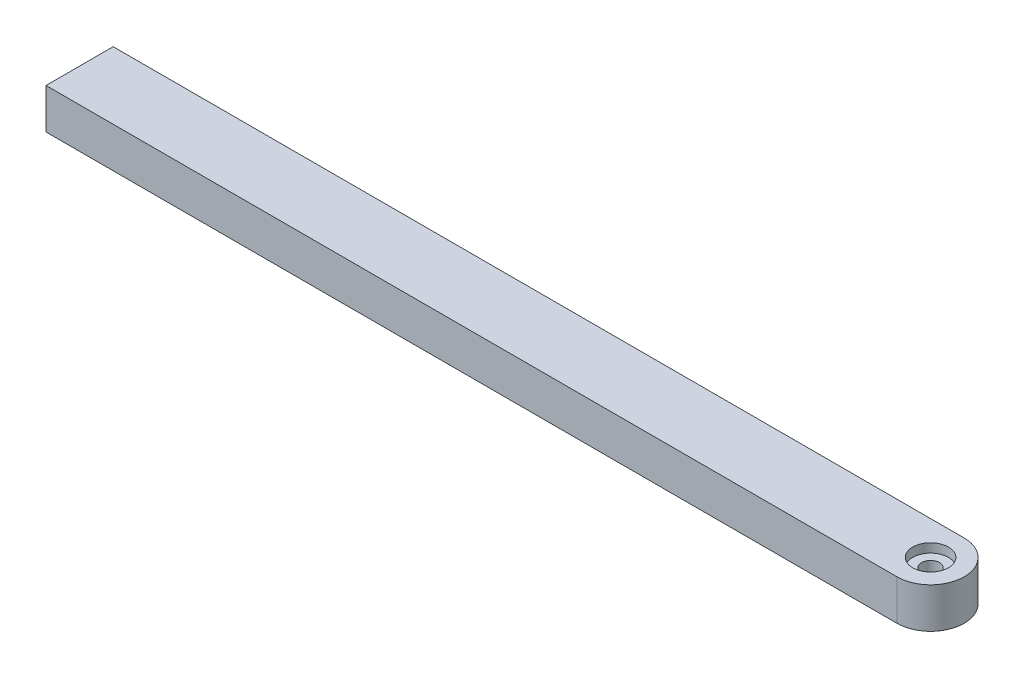
ISO-10303-21;
HEADER;
FILE_DESCRIPTION(('STEP AP214'),'2;1');
FILE_NAME('part.step','',(''),(''),'','','');
FILE_SCHEMA(('AUTOMOTIVE_DESIGN { 1 0 10303 214 1 1 1 1 }'));
ENDSEC;
DATA;
#1=APPLICATION_CONTEXT('core data for automotive mechanical design processes');
#2=APPLICATION_PROTOCOL_DEFINITION('international standard','automotive_design',2000,#1);
#3=PRODUCT_CONTEXT('',#1,'mechanical');
#4=PRODUCT('Part','Part','',(#3));
#5=PRODUCT_RELATED_PRODUCT_CATEGORY('part','',(#4));
#6=PRODUCT_DEFINITION_FORMATION('','',#4);
#7=PRODUCT_DEFINITION_CONTEXT('part definition',#1,'design');
#8=PRODUCT_DEFINITION('design','',#6,#7);
#9=PRODUCT_DEFINITION_SHAPE('','',#8);
#10=(LENGTH_UNIT() NAMED_UNIT(*) SI_UNIT(.MILLI.,.METRE.));
#11=(NAMED_UNIT(*) PLANE_ANGLE_UNIT() SI_UNIT($,.RADIAN.));
#12=(NAMED_UNIT(*) SI_UNIT($,.STERADIAN.) SOLID_ANGLE_UNIT());
#13=UNCERTAINTY_MEASURE_WITH_UNIT(LENGTH_MEASURE(1.E-05),#10,'distance_accuracy_value','');
#14=(GEOMETRIC_REPRESENTATION_CONTEXT(3) GLOBAL_UNCERTAINTY_ASSIGNED_CONTEXT((#13)) GLOBAL_UNIT_ASSIGNED_CONTEXT((#10,
#11,#12)) REPRESENTATION_CONTEXT('',''));
#15=CARTESIAN_POINT('',(0.,0.,0.));
#16=DIRECTION('',(0.,0.,1.));
#17=DIRECTION('',(1.,0.,0.));
#18=AXIS2_PLACEMENT_3D('',#15,#16,#17);
#19=CARTESIAN_POINT('',(180.,18.,0.));
#20=DIRECTION('',(0.,-1.,0.));
#21=DIRECTION('',(0.,0.,-1.));
#22=AXIS2_PLACEMENT_3D('',#19,#20,#21);
#23=CYLINDRICAL_SURFACE('',#22,3.99999999999999);
#24=CARTESIAN_POINT('',(180.,0.,0.));
#25=DIRECTION('',(0.,1.,0.));
#26=DIRECTION('',(0.,0.,1.));
#27=AXIS2_PLACEMENT_3D('',#24,#25,#26);
#28=CIRCLE('',#27,3.99999999999999);
#29=CARTESIAN_POINT('',(180.,0.,3.99999999999999));
#30=VERTEX_POINT('',#29);
#31=EDGE_CURVE('E107',#30,#30,#28,.T.);
#32=ORIENTED_EDGE('',*,*,#31,.F.);
#33=EDGE_LOOP('',(#32));
#34=FACE_BOUND('',#33,.T.);
#35=CARTESIAN_POINT('',(180.,14.,0.));
#36=DIRECTION('',(0.,1.,0.));
#37=DIRECTION('',(0.,0.,1.));
#38=AXIS2_PLACEMENT_3D('',#35,#36,#37);
#39=CIRCLE('',#38,3.99999999999999);
#40=CARTESIAN_POINT('',(180.,14.,3.99999999999999));
#41=VERTEX_POINT('',#40);
#42=EDGE_CURVE('E42',#41,#41,#39,.T.);
#43=ORIENTED_EDGE('',*,*,#42,.T.);
#44=EDGE_LOOP('',(#43));
#45=FACE_BOUND('',#44,.T.);
#46=ADVANCED_FACE('F38',(#34,#45),#23,.F.);
#47=CARTESIAN_POINT('',(180.,18.,0.));
#48=DIRECTION('',(0.,-1.,0.));
#49=DIRECTION('',(0.,0.,-1.));
#50=AXIS2_PLACEMENT_3D('',#47,#48,#49);
#51=PLANE('',#50);
#52=CARTESIAN_POINT('',(180.,18.,0.));
#53=DIRECTION('',(0.,1.,0.));
#54=DIRECTION('',(0.,0.,1.));
#55=AXIS2_PLACEMENT_3D('',#52,#53,#54);
#56=CIRCLE('',#55,8.00000000000001);
#57=CARTESIAN_POINT('',(180.,18.,8.00000000000001));
#58=VERTEX_POINT('',#57);
#59=EDGE_CURVE('E123',#58,#58,#56,.T.);
#60=ORIENTED_EDGE('',*,*,#59,.F.);
#61=EDGE_LOOP('',(#60));
#62=FACE_BOUND('',#61,.T.);
#63=DIRECTION('',(-1.,0.,0.));
#64=VECTOR('',#63,1.);
#65=CARTESIAN_POINT('',(-200.,18.,-15.));
#66=LINE('',#65,#64);
#67=CARTESIAN_POINT('',(180.,18.,-15.));
#68=VERTEX_POINT('',#67);
#69=CARTESIAN_POINT('',(-200.,18.,-15.));
#70=VERTEX_POINT('',#69);
#71=EDGE_CURVE('E91',#68,#70,#66,.T.);
#72=ORIENTED_EDGE('',*,*,#71,.T.);
#73=DIRECTION('',(0.,0.,1.));
#74=VECTOR('',#73,1.);
#75=CARTESIAN_POINT('',(-200.,18.,-15.));
#76=LINE('',#75,#74);
#77=CARTESIAN_POINT('',(-200.,18.,15.));
#78=VERTEX_POINT('',#77);
#79=EDGE_CURVE('E86',#70,#78,#76,.T.);
#80=ORIENTED_EDGE('',*,*,#79,.T.);
#81=DIRECTION('',(1.,0.,0.));
#82=VECTOR('',#81,1.);
#83=CARTESIAN_POINT('',(-200.,18.,15.));
#84=LINE('',#83,#82);
#85=CARTESIAN_POINT('',(180.,18.,15.));
#86=VERTEX_POINT('',#85);
#87=EDGE_CURVE('E89',#78,#86,#84,.T.);
#88=ORIENTED_EDGE('',*,*,#87,.T.);
#89=CARTESIAN_POINT('',(180.,18.,0.));
#90=DIRECTION('',(0.,1.,0.));
#91=DIRECTION('',(0.,0.,-1.));
#92=AXIS2_PLACEMENT_3D('',#89,#90,#91);
#93=CIRCLE('',#92,15.);
#94=EDGE_CURVE('E56',#86,#68,#93,.T.);
#95=ORIENTED_EDGE('',*,*,#94,.T.);
#96=EDGE_LOOP('',(#72,#80,#88,#95));
#97=FACE_BOUND('',#96,.T.);
#98=ADVANCED_FACE('F87',(#62,#97),#51,.F.);
#99=CARTESIAN_POINT('',(180.,0.,0.));
#100=DIRECTION('',(0.,-1.,0.));
#101=DIRECTION('',(0.,0.,-1.));
#102=AXIS2_PLACEMENT_3D('',#99,#100,#101);
#103=PLANE('',#102);
#104=DIRECTION('',(-1.,0.,0.));
#105=VECTOR('',#104,1.);
#106=CARTESIAN_POINT('',(-200.,0.,-15.));
#107=LINE('',#106,#105);
#108=CARTESIAN_POINT('',(180.,0.,-15.));
#109=VERTEX_POINT('',#108);
#110=CARTESIAN_POINT('',(-200.,0.,-15.));
#111=VERTEX_POINT('',#110);
#112=EDGE_CURVE('E104',#109,#111,#107,.T.);
#113=ORIENTED_EDGE('',*,*,#112,.F.);
#114=CARTESIAN_POINT('',(180.,0.,0.));
#115=DIRECTION('',(0.,1.,0.));
#116=DIRECTION('',(0.,0.,-1.));
#117=AXIS2_PLACEMENT_3D('',#114,#115,#116);
#118=CIRCLE('',#117,15.);
#119=CARTESIAN_POINT('',(180.,0.,15.));
#120=VERTEX_POINT('',#119);
#121=EDGE_CURVE('E79',#120,#109,#118,.T.);
#122=ORIENTED_EDGE('',*,*,#121,.F.);
#123=DIRECTION('',(1.,0.,0.));
#124=VECTOR('',#123,1.);
#125=CARTESIAN_POINT('',(-200.,0.,15.));
#126=LINE('',#125,#124);
#127=CARTESIAN_POINT('',(-200.,0.,15.));
#128=VERTEX_POINT('',#127);
#129=EDGE_CURVE('E73',#128,#120,#126,.T.);
#130=ORIENTED_EDGE('',*,*,#129,.F.);
#131=DIRECTION('',(0.,0.,1.));
#132=VECTOR('',#131,1.);
#133=CARTESIAN_POINT('',(-200.,0.,-15.));
#134=LINE('',#133,#132);
#135=EDGE_CURVE('E95',#111,#128,#134,.T.);
#136=ORIENTED_EDGE('',*,*,#135,.F.);
#137=EDGE_LOOP('',(#113,#122,#130,#136));
#138=FACE_BOUND('',#137,.T.);
#139=ORIENTED_EDGE('',*,*,#31,.T.);
#140=EDGE_LOOP('',(#139));
#141=FACE_BOUND('',#140,.T.);
#142=ADVANCED_FACE('F116',(#138,#141),#103,.T.);
#143=CARTESIAN_POINT('',(-200.,18.,-15.));
#144=DIRECTION('',(0.,0.,1.));
#145=DIRECTION('',(1.,0.,0.));
#146=AXIS2_PLACEMENT_3D('',#143,#144,#145);
#147=PLANE('',#146);
#148=ORIENTED_EDGE('',*,*,#112,.T.);
#149=DIRECTION('',(0.,-1.,0.));
#150=VECTOR('',#149,1.);
#151=CARTESIAN_POINT('',(-200.,18.,-15.));
#152=LINE('',#151,#150);
#153=EDGE_CURVE('E11',#70,#111,#152,.T.);
#154=ORIENTED_EDGE('',*,*,#153,.F.);
#155=ORIENTED_EDGE('',*,*,#71,.F.);
#156=DIRECTION('',(0.,-1.,0.));
#157=VECTOR('',#156,1.);
#158=CARTESIAN_POINT('',(180.,18.,-15.));
#159=LINE('',#158,#157);
#160=EDGE_CURVE('E100',#68,#109,#159,.T.);
#161=ORIENTED_EDGE('',*,*,#160,.T.);
#162=EDGE_LOOP('',(#148,#154,#155,#161));
#163=FACE_BOUND('',#162,.T.);
#164=ADVANCED_FACE('F40',(#163),#147,.F.);
#165=CARTESIAN_POINT('',(-200.,18.,-15.));
#166=DIRECTION('',(1.,0.,0.));
#167=DIRECTION('',(0.,0.,-1.));
#168=AXIS2_PLACEMENT_3D('',#165,#166,#167);
#169=PLANE('',#168);
#170=ORIENTED_EDGE('',*,*,#135,.T.);
#171=DIRECTION('',(0.,-1.,0.));
#172=VECTOR('',#171,1.);
#173=CARTESIAN_POINT('',(-200.,18.,15.));
#174=LINE('',#173,#172);
#175=EDGE_CURVE('E48',#78,#128,#174,.T.);
#176=ORIENTED_EDGE('',*,*,#175,.F.);
#177=ORIENTED_EDGE('',*,*,#79,.F.);
#178=ORIENTED_EDGE('',*,*,#153,.T.);
#179=EDGE_LOOP('',(#170,#176,#177,#178));
#180=FACE_BOUND('',#179,.T.);
#181=ADVANCED_FACE('F94',(#180),#169,.F.);
#182=CARTESIAN_POINT('',(-200.,18.,15.));
#183=DIRECTION('',(0.,0.,-1.));
#184=DIRECTION('',(-1.,0.,0.));
#185=AXIS2_PLACEMENT_3D('',#182,#183,#184);
#186=PLANE('',#185);
#187=ORIENTED_EDGE('',*,*,#129,.T.);
#188=DIRECTION('',(0.,-1.,0.));
#189=VECTOR('',#188,1.);
#190=CARTESIAN_POINT('',(180.,18.,15.));
#191=LINE('',#190,#189);
#192=EDGE_CURVE('E96',#86,#120,#191,.T.);
#193=ORIENTED_EDGE('',*,*,#192,.F.);
#194=ORIENTED_EDGE('',*,*,#87,.F.);
#195=ORIENTED_EDGE('',*,*,#175,.T.);
#196=EDGE_LOOP('',(#187,#193,#194,#195));
#197=FACE_BOUND('',#196,.T.);
#198=ADVANCED_FACE('F98',(#197),#186,.F.);
#199=CARTESIAN_POINT('',(180.,18.,0.));
#200=DIRECTION('',(0.,-1.,0.));
#201=DIRECTION('',(0.,0.,-1.));
#202=AXIS2_PLACEMENT_3D('',#199,#200,#201);
#203=CYLINDRICAL_SURFACE('',#202,15.);
#204=ORIENTED_EDGE('',*,*,#121,.T.);
#205=ORIENTED_EDGE('',*,*,#160,.F.);
#206=ORIENTED_EDGE('',*,*,#94,.F.);
#207=ORIENTED_EDGE('',*,*,#192,.T.);
#208=EDGE_LOOP('',(#204,#205,#206,#207));
#209=FACE_BOUND('',#208,.T.);
#210=ADVANCED_FACE('F113',(#209),#203,.T.);
#211=CARTESIAN_POINT('',(180.,14.,0.));
#212=DIRECTION('',(0.,1.,0.));
#213=DIRECTION('',(0.,0.,1.));
#214=AXIS2_PLACEMENT_3D('',#211,#212,#213);
#215=CYLINDRICAL_SURFACE('',#214,8.00000000000001);
#216=CARTESIAN_POINT('',(180.,14.,0.));
#217=DIRECTION('',(0.,1.,0.));
#218=DIRECTION('',(0.,0.,1.));
#219=AXIS2_PLACEMENT_3D('',#216,#217,#218);
#220=CIRCLE('',#219,8.00000000000001);
#221=CARTESIAN_POINT('',(180.,14.,8.00000000000001));
#222=VERTEX_POINT('',#221);
#223=EDGE_CURVE('E126',#222,#222,#220,.T.);
#224=ORIENTED_EDGE('',*,*,#223,.F.);
#225=EDGE_LOOP('',(#224));
#226=FACE_BOUND('',#225,.T.);
#227=ORIENTED_EDGE('',*,*,#59,.T.);
#228=EDGE_LOOP('',(#227));
#229=FACE_BOUND('',#228,.T.);
#230=ADVANCED_FACE('F137',(#226,#229),#215,.F.);
#231=CARTESIAN_POINT('',(180.,14.,0.));
#232=DIRECTION('',(0.,1.,0.));
#233=DIRECTION('',(0.,0.,1.));
#234=AXIS2_PLACEMENT_3D('',#231,#232,#233);
#235=PLANE('',#234);
#236=ORIENTED_EDGE('',*,*,#42,.F.);
#237=EDGE_LOOP('',(#236));
#238=FACE_BOUND('',#237,.T.);
#239=ORIENTED_EDGE('',*,*,#223,.T.);
#240=EDGE_LOOP('',(#239));
#241=FACE_BOUND('',#240,.T.);
#242=ADVANCED_FACE('F135',(#238,#241),#235,.T.);
#243=CLOSED_SHELL('',(#46,#98,#142,#164,#181,#198,#210,#230,#242));
#244=MANIFOLD_SOLID_BREP('B2',#243);
#245=ADVANCED_BREP_SHAPE_REPRESENTATION('',(#18,#244),#14);
#246=SHAPE_DEFINITION_REPRESENTATION(#9,#245);
ENDSEC;
END-ISO-10303-21;
